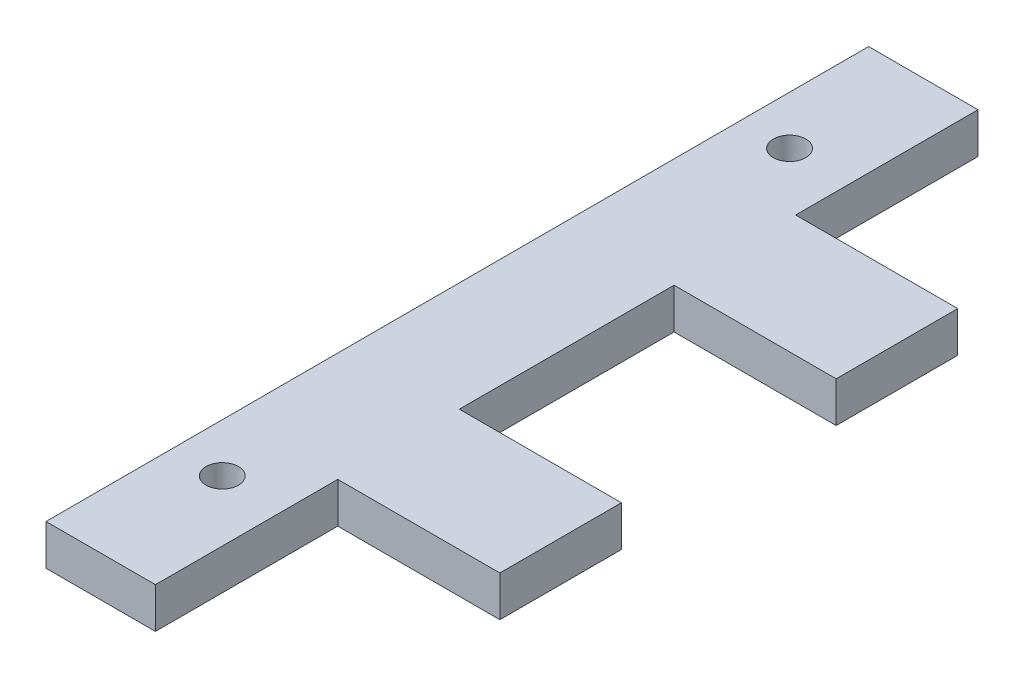
ISO-10303-21;
HEADER;
FILE_DESCRIPTION(('STEP AP214'),'2;1');
FILE_NAME('part.step','',(''),(''),'','','');
FILE_SCHEMA(('AUTOMOTIVE_DESIGN { 1 0 10303 214 1 1 1 1 }'));
ENDSEC;
DATA;
#1=APPLICATION_CONTEXT('core data for automotive mechanical design processes');
#2=APPLICATION_PROTOCOL_DEFINITION('international standard','automotive_design',2000,#1);
#3=PRODUCT_CONTEXT('',#1,'mechanical');
#4=PRODUCT('Part','Part','',(#3));
#5=PRODUCT_RELATED_PRODUCT_CATEGORY('part','',(#4));
#6=PRODUCT_DEFINITION_FORMATION('','',#4);
#7=PRODUCT_DEFINITION_CONTEXT('part definition',#1,'design');
#8=PRODUCT_DEFINITION('design','',#6,#7);
#9=PRODUCT_DEFINITION_SHAPE('','',#8);
#10=(LENGTH_UNIT() NAMED_UNIT(*) SI_UNIT(.MILLI.,.METRE.));
#11=(NAMED_UNIT(*) PLANE_ANGLE_UNIT() SI_UNIT($,.RADIAN.));
#12=(NAMED_UNIT(*) SI_UNIT($,.STERADIAN.) SOLID_ANGLE_UNIT());
#13=UNCERTAINTY_MEASURE_WITH_UNIT(LENGTH_MEASURE(1.E-05),#10,'distance_accuracy_value','');
#14=(GEOMETRIC_REPRESENTATION_CONTEXT(3) GLOBAL_UNCERTAINTY_ASSIGNED_CONTEXT((#13)) GLOBAL_UNIT_ASSIGNED_CONTEXT((#10,
#11,#12)) REPRESENTATION_CONTEXT('',''));
#15=CARTESIAN_POINT('',(0.,0.,0.));
#16=DIRECTION('',(0.,0.,1.));
#17=DIRECTION('',(1.,0.,0.));
#18=AXIS2_PLACEMENT_3D('',#15,#16,#17);
#19=CARTESIAN_POINT('',(2.7,1.,0.));
#20=DIRECTION('',(1.,0.,0.));
#21=DIRECTION('',(0.,0.,-1.));
#22=AXIS2_PLACEMENT_3D('',#19,#20,#21);
#23=PLANE('',#22);
#24=DIRECTION('',(0.,0.,1.));
#25=VECTOR('',#24,1.);
#26=CARTESIAN_POINT('',(2.7,0.,0.));
#27=LINE('',#26,#25);
#28=CARTESIAN_POINT('',(2.7,0.,0.));
#29=VERTEX_POINT('',#28);
#30=CARTESIAN_POINT('',(2.7,0.,4.5));
#31=VERTEX_POINT('',#30);
#32=EDGE_CURVE('E157',#29,#31,#27,.T.);
#33=ORIENTED_EDGE('',*,*,#32,.F.);
#34=DIRECTION('',(0.,-1.,0.));
#35=VECTOR('',#34,1.);
#36=CARTESIAN_POINT('',(2.7,1.,0.));
#37=LINE('',#36,#35);
#38=CARTESIAN_POINT('',(2.7,1.,0.));
#39=VERTEX_POINT('',#38);
#40=EDGE_CURVE('E11',#39,#29,#37,.T.);
#41=ORIENTED_EDGE('',*,*,#40,.F.);
#42=DIRECTION('',(0.,0.,1.));
#43=VECTOR('',#42,1.);
#44=CARTESIAN_POINT('',(2.7,1.,0.));
#45=LINE('',#44,#43);
#46=CARTESIAN_POINT('',(2.7,1.,4.5));
#47=VERTEX_POINT('',#46);
#48=EDGE_CURVE('E267',#39,#47,#45,.T.);
#49=ORIENTED_EDGE('',*,*,#48,.T.);
#50=DIRECTION('',(0.,-1.,0.));
#51=VECTOR('',#50,1.);
#52=CARTESIAN_POINT('',(2.7,1.,4.5));
#53=LINE('',#52,#51);
#54=EDGE_CURVE('E50',#47,#31,#53,.T.);
#55=ORIENTED_EDGE('',*,*,#54,.T.);
#56=EDGE_LOOP('',(#33,#41,#49,#55));
#57=FACE_BOUND('',#56,.T.);
#58=ADVANCED_FACE('F33',(#57),#23,.T.);
#59=CARTESIAN_POINT('',(0.,1.,0.));
#60=DIRECTION('',(0.,0.,-1.));
#61=DIRECTION('',(-1.,0.,0.));
#62=AXIS2_PLACEMENT_3D('',#59,#60,#61);
#63=PLANE('',#62);
#64=DIRECTION('',(1.,0.,0.));
#65=VECTOR('',#64,1.);
#66=CARTESIAN_POINT('',(0.,0.,0.));
#67=LINE('',#66,#65);
#68=CARTESIAN_POINT('',(0.,0.,0.));
#69=VERTEX_POINT('',#68);
#70=EDGE_CURVE('E159',#69,#29,#67,.T.);
#71=ORIENTED_EDGE('',*,*,#70,.F.);
#72=DIRECTION('',(0.,-1.,0.));
#73=VECTOR('',#72,1.);
#74=CARTESIAN_POINT('',(0.,1.,0.));
#75=LINE('',#74,#73);
#76=CARTESIAN_POINT('',(0.,1.,0.));
#77=VERTEX_POINT('',#76);
#78=EDGE_CURVE('E42',#77,#69,#75,.T.);
#79=ORIENTED_EDGE('',*,*,#78,.F.);
#80=DIRECTION('',(1.,0.,0.));
#81=VECTOR('',#80,1.);
#82=CARTESIAN_POINT('',(0.,1.,0.));
#83=LINE('',#82,#81);
#84=EDGE_CURVE('E216',#77,#39,#83,.T.);
#85=ORIENTED_EDGE('',*,*,#84,.T.);
#86=ORIENTED_EDGE('',*,*,#40,.T.);
#87=EDGE_LOOP('',(#71,#79,#85,#86));
#88=FACE_BOUND('',#87,.T.);
#89=ADVANCED_FACE('F215',(#88),#63,.T.);
#90=CARTESIAN_POINT('',(0.,1.,0.));
#91=DIRECTION('',(1.,0.,0.));
#92=DIRECTION('',(0.,0.,-1.));
#93=AXIS2_PLACEMENT_3D('',#90,#91,#92);
#94=PLANE('',#93);
#95=DIRECTION('',(0.,0.,1.));
#96=VECTOR('',#95,1.);
#97=CARTESIAN_POINT('',(0.,0.,0.));
#98=LINE('',#97,#96);
#99=CARTESIAN_POINT('',(0.,0.,20.3));
#100=VERTEX_POINT('',#99);
#101=EDGE_CURVE('E164',#69,#100,#98,.T.);
#102=ORIENTED_EDGE('',*,*,#101,.T.);
#103=DIRECTION('',(0.,-1.,0.));
#104=VECTOR('',#103,1.);
#105=CARTESIAN_POINT('',(0.,1.,20.3));
#106=LINE('',#105,#104);
#107=CARTESIAN_POINT('',(0.,1.,20.3));
#108=VERTEX_POINT('',#107);
#109=EDGE_CURVE('E199',#108,#100,#106,.T.);
#110=ORIENTED_EDGE('',*,*,#109,.F.);
#111=DIRECTION('',(0.,0.,1.));
#112=VECTOR('',#111,1.);
#113=CARTESIAN_POINT('',(0.,1.,0.));
#114=LINE('',#113,#112);
#115=EDGE_CURVE('E207',#77,#108,#114,.T.);
#116=ORIENTED_EDGE('',*,*,#115,.F.);
#117=ORIENTED_EDGE('',*,*,#78,.T.);
#118=EDGE_LOOP('',(#102,#110,#116,#117));
#119=FACE_BOUND('',#118,.T.);
#120=ADVANCED_FACE('F204',(#119),#94,.F.);
#121=CARTESIAN_POINT('',(0.,1.,20.3));
#122=DIRECTION('',(0.,0.,-1.));
#123=DIRECTION('',(-1.,0.,0.));
#124=AXIS2_PLACEMENT_3D('',#121,#122,#123);
#125=PLANE('',#124);
#126=DIRECTION('',(1.,0.,0.));
#127=VECTOR('',#126,1.);
#128=CARTESIAN_POINT('',(0.,0.,20.3));
#129=LINE('',#128,#127);
#130=CARTESIAN_POINT('',(2.7,0.,20.3));
#131=VERTEX_POINT('',#130);
#132=EDGE_CURVE('E167',#100,#131,#129,.T.);
#133=ORIENTED_EDGE('',*,*,#132,.T.);
#134=DIRECTION('',(0.,-1.,0.));
#135=VECTOR('',#134,1.);
#136=CARTESIAN_POINT('',(2.7,1.,20.3));
#137=LINE('',#136,#135);
#138=CARTESIAN_POINT('',(2.7,1.,20.3));
#139=VERTEX_POINT('',#138);
#140=EDGE_CURVE('E197',#139,#131,#137,.T.);
#141=ORIENTED_EDGE('',*,*,#140,.F.);
#142=DIRECTION('',(1.,0.,0.));
#143=VECTOR('',#142,1.);
#144=CARTESIAN_POINT('',(0.,1.,20.3));
#145=LINE('',#144,#143);
#146=EDGE_CURVE('E264',#108,#139,#145,.T.);
#147=ORIENTED_EDGE('',*,*,#146,.F.);
#148=ORIENTED_EDGE('',*,*,#109,.T.);
#149=EDGE_LOOP('',(#133,#141,#147,#148));
#150=FACE_BOUND('',#149,.T.);
#151=ADVANCED_FACE('F242',(#150),#125,.F.);
#152=CARTESIAN_POINT('',(2.7,0.,15.8));
#153=VERTEX_POINT('',#152);
#154=EDGE_CURVE('E161',#153,#131,#27,.T.);
#155=ORIENTED_EDGE('',*,*,#154,.F.);
#156=DIRECTION('',(0.,-1.,0.));
#157=VECTOR('',#156,1.);
#158=CARTESIAN_POINT('',(2.7,1.,15.8));
#159=LINE('',#158,#157);
#160=CARTESIAN_POINT('',(2.7,1.,15.8));
#161=VERTEX_POINT('',#160);
#162=EDGE_CURVE('E195',#161,#153,#159,.T.);
#163=ORIENTED_EDGE('',*,*,#162,.F.);
#164=EDGE_CURVE('E262',#161,#139,#45,.T.);
#165=ORIENTED_EDGE('',*,*,#164,.T.);
#166=ORIENTED_EDGE('',*,*,#140,.T.);
#167=EDGE_LOOP('',(#155,#163,#165,#166));
#168=FACE_BOUND('',#167,.T.);
#169=ADVANCED_FACE('F232',(#168),#23,.T.);
#170=CARTESIAN_POINT('',(0.,1.,15.8));
#171=DIRECTION('',(0.,0.,-1.));
#172=DIRECTION('',(-1.,0.,0.));
#173=AXIS2_PLACEMENT_3D('',#170,#171,#172);
#174=PLANE('',#173);
#175=DIRECTION('',(1.,0.,0.));
#176=VECTOR('',#175,1.);
#177=CARTESIAN_POINT('',(0.,0.,15.8));
#178=LINE('',#177,#176);
#179=CARTESIAN_POINT('',(6.7,0.,15.8));
#180=VERTEX_POINT('',#179);
#181=EDGE_CURVE('E170',#153,#180,#178,.T.);
#182=ORIENTED_EDGE('',*,*,#181,.T.);
#183=DIRECTION('',(0.,-1.,0.));
#184=VECTOR('',#183,1.);
#185=CARTESIAN_POINT('',(6.7,1.,15.8));
#186=LINE('',#185,#184);
#187=CARTESIAN_POINT('',(6.7,1.,15.8));
#188=VERTEX_POINT('',#187);
#189=EDGE_CURVE('E193',#188,#180,#186,.T.);
#190=ORIENTED_EDGE('',*,*,#189,.F.);
#191=DIRECTION('',(1.,0.,0.));
#192=VECTOR('',#191,1.);
#193=CARTESIAN_POINT('',(0.,1.,15.8));
#194=LINE('',#193,#192);
#195=EDGE_CURVE('E271',#161,#188,#194,.T.);
#196=ORIENTED_EDGE('',*,*,#195,.F.);
#197=ORIENTED_EDGE('',*,*,#162,.T.);
#198=EDGE_LOOP('',(#182,#190,#196,#197));
#199=FACE_BOUND('',#198,.T.);
#200=ADVANCED_FACE('F241',(#199),#174,.F.);
#201=CARTESIAN_POINT('',(6.7,1.,0.));
#202=DIRECTION('',(1.,0.,0.));
#203=DIRECTION('',(0.,0.,-1.));
#204=AXIS2_PLACEMENT_3D('',#201,#202,#203);
#205=PLANE('',#204);
#206=DIRECTION('',(0.,0.,1.));
#207=VECTOR('',#206,1.);
#208=CARTESIAN_POINT('',(6.7,0.,0.));
#209=LINE('',#208,#207);
#210=CARTESIAN_POINT('',(6.7,0.,12.8));
#211=VERTEX_POINT('',#210);
#212=EDGE_CURVE('E173',#211,#180,#209,.T.);
#213=ORIENTED_EDGE('',*,*,#212,.F.);
#214=DIRECTION('',(0.,-1.,0.));
#215=VECTOR('',#214,1.);
#216=CARTESIAN_POINT('',(6.7,1.,12.8));
#217=LINE('',#216,#215);
#218=CARTESIAN_POINT('',(6.7,1.,12.8));
#219=VERTEX_POINT('',#218);
#220=EDGE_CURVE('E191',#219,#211,#217,.T.);
#221=ORIENTED_EDGE('',*,*,#220,.F.);
#222=DIRECTION('',(0.,0.,1.));
#223=VECTOR('',#222,1.);
#224=CARTESIAN_POINT('',(6.7,1.,0.));
#225=LINE('',#224,#223);
#226=EDGE_CURVE('E273',#219,#188,#225,.T.);
#227=ORIENTED_EDGE('',*,*,#226,.T.);
#228=ORIENTED_EDGE('',*,*,#189,.T.);
#229=EDGE_LOOP('',(#213,#221,#227,#228));
#230=FACE_BOUND('',#229,.T.);
#231=ADVANCED_FACE('F251',(#230),#205,.T.);
#232=CARTESIAN_POINT('',(0.,1.,12.8));
#233=DIRECTION('',(0.,0.,-1.));
#234=DIRECTION('',(-1.,0.,0.));
#235=AXIS2_PLACEMENT_3D('',#232,#233,#234);
#236=PLANE('',#235);
#237=DIRECTION('',(1.,0.,0.));
#238=VECTOR('',#237,1.);
#239=CARTESIAN_POINT('',(0.,0.,12.8));
#240=LINE('',#239,#238);
#241=CARTESIAN_POINT('',(2.7,0.,12.8));
#242=VERTEX_POINT('',#241);
#243=EDGE_CURVE('E176',#242,#211,#240,.T.);
#244=ORIENTED_EDGE('',*,*,#243,.F.);
#245=DIRECTION('',(0.,-1.,0.));
#246=VECTOR('',#245,1.);
#247=CARTESIAN_POINT('',(2.7,1.,12.8));
#248=LINE('',#247,#246);
#249=CARTESIAN_POINT('',(2.7,1.,12.8));
#250=VERTEX_POINT('',#249);
#251=EDGE_CURVE('E189',#250,#242,#248,.T.);
#252=ORIENTED_EDGE('',*,*,#251,.F.);
#253=DIRECTION('',(1.,0.,0.));
#254=VECTOR('',#253,1.);
#255=CARTESIAN_POINT('',(0.,1.,12.8));
#256=LINE('',#255,#254);
#257=EDGE_CURVE('E275',#250,#219,#256,.T.);
#258=ORIENTED_EDGE('',*,*,#257,.T.);
#259=ORIENTED_EDGE('',*,*,#220,.T.);
#260=EDGE_LOOP('',(#244,#252,#258,#259));
#261=FACE_BOUND('',#260,.T.);
#262=ADVANCED_FACE('F245',(#261),#236,.T.);
#263=CARTESIAN_POINT('',(2.7,0.,7.5));
#264=VERTEX_POINT('',#263);
#265=EDGE_CURVE('E160',#264,#242,#27,.T.);
#266=ORIENTED_EDGE('',*,*,#265,.F.);
#267=DIRECTION('',(0.,-1.,0.));
#268=VECTOR('',#267,1.);
#269=CARTESIAN_POINT('',(2.7,1.,7.5));
#270=LINE('',#269,#268);
#271=CARTESIAN_POINT('',(2.7,1.,7.5));
#272=VERTEX_POINT('',#271);
#273=EDGE_CURVE('E143',#272,#264,#270,.T.);
#274=ORIENTED_EDGE('',*,*,#273,.F.);
#275=EDGE_CURVE('E133',#272,#250,#45,.T.);
#276=ORIENTED_EDGE('',*,*,#275,.T.);
#277=ORIENTED_EDGE('',*,*,#251,.T.);
#278=EDGE_LOOP('',(#266,#274,#276,#277));
#279=FACE_BOUND('',#278,.T.);
#280=ADVANCED_FACE('F233',(#279),#23,.T.);
#281=CARTESIAN_POINT('',(0.,1.,7.5));
#282=DIRECTION('',(0.,0.,-1.));
#283=DIRECTION('',(-1.,0.,0.));
#284=AXIS2_PLACEMENT_3D('',#281,#282,#283);
#285=PLANE('',#284);
#286=DIRECTION('',(1.,0.,0.));
#287=VECTOR('',#286,1.);
#288=CARTESIAN_POINT('',(0.,0.,7.5));
#289=LINE('',#288,#287);
#290=CARTESIAN_POINT('',(6.7,0.,7.5));
#291=VERTEX_POINT('',#290);
#292=EDGE_CURVE('E140',#264,#291,#289,.T.);
#293=ORIENTED_EDGE('',*,*,#292,.T.);
#294=DIRECTION('',(0.,-1.,0.));
#295=VECTOR('',#294,1.);
#296=CARTESIAN_POINT('',(6.7,1.,7.5));
#297=LINE('',#296,#295);
#298=CARTESIAN_POINT('',(6.7,1.,7.5));
#299=VERTEX_POINT('',#298);
#300=EDGE_CURVE('E137',#299,#291,#297,.T.);
#301=ORIENTED_EDGE('',*,*,#300,.F.);
#302=DIRECTION('',(1.,0.,0.));
#303=VECTOR('',#302,1.);
#304=CARTESIAN_POINT('',(0.,1.,7.5));
#305=LINE('',#304,#303);
#306=EDGE_CURVE('E125',#272,#299,#305,.T.);
#307=ORIENTED_EDGE('',*,*,#306,.F.);
#308=ORIENTED_EDGE('',*,*,#273,.T.);
#309=EDGE_LOOP('',(#293,#301,#307,#308));
#310=FACE_BOUND('',#309,.T.);
#311=ADVANCED_FACE('F138',(#310),#285,.F.);
#312=CARTESIAN_POINT('',(6.7,1.,0.));
#313=DIRECTION('',(1.,0.,0.));
#314=DIRECTION('',(0.,0.,-1.));
#315=AXIS2_PLACEMENT_3D('',#312,#313,#314);
#316=PLANE('',#315);
#317=DIRECTION('',(0.,0.,1.));
#318=VECTOR('',#317,1.);
#319=CARTESIAN_POINT('',(6.7,0.,0.));
#320=LINE('',#319,#318);
#321=CARTESIAN_POINT('',(6.7,0.,4.5));
#322=VERTEX_POINT('',#321);
#323=EDGE_CURVE('E180',#322,#291,#320,.T.);
#324=ORIENTED_EDGE('',*,*,#323,.F.);
#325=DIRECTION('',(0.,-1.,0.));
#326=VECTOR('',#325,1.);
#327=CARTESIAN_POINT('',(6.7,1.,4.5));
#328=LINE('',#327,#326);
#329=CARTESIAN_POINT('',(6.7,1.,4.5));
#330=VERTEX_POINT('',#329);
#331=EDGE_CURVE('E87',#330,#322,#328,.T.);
#332=ORIENTED_EDGE('',*,*,#331,.F.);
#333=DIRECTION('',(0.,0.,1.));
#334=VECTOR('',#333,1.);
#335=CARTESIAN_POINT('',(6.7,1.,0.));
#336=LINE('',#335,#334);
#337=EDGE_CURVE('E130',#330,#299,#336,.T.);
#338=ORIENTED_EDGE('',*,*,#337,.T.);
#339=ORIENTED_EDGE('',*,*,#300,.T.);
#340=EDGE_LOOP('',(#324,#332,#338,#339));
#341=FACE_BOUND('',#340,.T.);
#342=ADVANCED_FACE('F145',(#341),#316,.T.);
#343=CARTESIAN_POINT('',(1.2,1.,3.15));
#344=DIRECTION('',(0.,-1.,0.));
#345=DIRECTION('',(0.,0.,-1.));
#346=AXIS2_PLACEMENT_3D('',#343,#344,#345);
#347=CYLINDRICAL_SURFACE('',#346,0.4);
#348=CARTESIAN_POINT('',(1.2,1.,3.15));
#349=DIRECTION('',(0.,1.,0.));
#350=DIRECTION('',(0.,0.,1.));
#351=AXIS2_PLACEMENT_3D('',#348,#349,#350);
#352=CIRCLE('',#351,0.4);
#353=CARTESIAN_POINT('',(1.2,1.,3.55));
#354=VERTEX_POINT('',#353);
#355=EDGE_CURVE('E278',#354,#354,#352,.T.);
#356=ORIENTED_EDGE('',*,*,#355,.T.);
#357=EDGE_LOOP('',(#356));
#358=FACE_BOUND('',#357,.T.);
#359=CARTESIAN_POINT('',(1.2,0.,3.15));
#360=DIRECTION('',(0.,1.,0.));
#361=DIRECTION('',(0.,0.,1.));
#362=AXIS2_PLACEMENT_3D('',#359,#360,#361);
#363=CIRCLE('',#362,0.4);
#364=CARTESIAN_POINT('',(1.2,0.,3.55));
#365=VERTEX_POINT('',#364);
#366=EDGE_CURVE('E154',#365,#365,#363,.T.);
#367=ORIENTED_EDGE('',*,*,#366,.F.);
#368=EDGE_LOOP('',(#367));
#369=FACE_BOUND('',#368,.T.);
#370=ADVANCED_FACE('F226',(#358,#369),#347,.F.);
#371=CARTESIAN_POINT('',(1.2,1.,17.15));
#372=DIRECTION('',(0.,-1.,0.));
#373=DIRECTION('',(0.,0.,-1.));
#374=AXIS2_PLACEMENT_3D('',#371,#372,#373);
#375=CYLINDRICAL_SURFACE('',#374,0.4);
#376=CARTESIAN_POINT('',(1.2,1.,17.15));
#377=DIRECTION('',(0.,1.,0.));
#378=DIRECTION('',(0.,0.,1.));
#379=AXIS2_PLACEMENT_3D('',#376,#377,#378);
#380=CIRCLE('',#379,0.4);
#381=CARTESIAN_POINT('',(1.2,1.,17.55));
#382=VERTEX_POINT('',#381);
#383=EDGE_CURVE('E185',#382,#382,#380,.T.);
#384=ORIENTED_EDGE('',*,*,#383,.T.);
#385=EDGE_LOOP('',(#384));
#386=FACE_BOUND('',#385,.T.);
#387=CARTESIAN_POINT('',(1.2,0.,17.15));
#388=DIRECTION('',(0.,1.,0.));
#389=DIRECTION('',(0.,0.,1.));
#390=AXIS2_PLACEMENT_3D('',#387,#388,#389);
#391=CIRCLE('',#390,0.4);
#392=CARTESIAN_POINT('',(1.2,0.,17.55));
#393=VERTEX_POINT('',#392);
#394=EDGE_CURVE('E151',#393,#393,#391,.T.);
#395=ORIENTED_EDGE('',*,*,#394,.F.);
#396=EDGE_LOOP('',(#395));
#397=FACE_BOUND('',#396,.T.);
#398=ADVANCED_FACE('F35',(#386,#397),#375,.F.);
#399=CARTESIAN_POINT('',(0.,1.,4.5));
#400=DIRECTION('',(0.,0.,-1.));
#401=DIRECTION('',(-1.,0.,0.));
#402=AXIS2_PLACEMENT_3D('',#399,#400,#401);
#403=PLANE('',#402);
#404=DIRECTION('',(1.,0.,0.));
#405=VECTOR('',#404,1.);
#406=CARTESIAN_POINT('',(0.,0.,4.5));
#407=LINE('',#406,#405);
#408=EDGE_CURVE('E182',#31,#322,#407,.T.);
#409=ORIENTED_EDGE('',*,*,#408,.F.);
#410=ORIENTED_EDGE('',*,*,#54,.F.);
#411=DIRECTION('',(1.,0.,0.));
#412=VECTOR('',#411,1.);
#413=CARTESIAN_POINT('',(0.,1.,4.5));
#414=LINE('',#413,#412);
#415=EDGE_CURVE('E146',#47,#330,#414,.T.);
#416=ORIENTED_EDGE('',*,*,#415,.T.);
#417=ORIENTED_EDGE('',*,*,#331,.T.);
#418=EDGE_LOOP('',(#409,#410,#416,#417));
#419=FACE_BOUND('',#418,.T.);
#420=ADVANCED_FACE('F217',(#419),#403,.T.);
#421=CARTESIAN_POINT('',(0.,1.,0.));
#422=DIRECTION('',(0.,1.,0.));
#423=DIRECTION('',(0.,0.,1.));
#424=AXIS2_PLACEMENT_3D('',#421,#422,#423);
#425=PLANE('',#424);
#426=ORIENTED_EDGE('',*,*,#383,.F.);
#427=EDGE_LOOP('',(#426));
#428=FACE_BOUND('',#427,.T.);
#429=ORIENTED_EDGE('',*,*,#355,.F.);
#430=EDGE_LOOP('',(#429));
#431=FACE_BOUND('',#430,.T.);
#432=ORIENTED_EDGE('',*,*,#48,.F.);
#433=ORIENTED_EDGE('',*,*,#84,.F.);
#434=ORIENTED_EDGE('',*,*,#115,.T.);
#435=ORIENTED_EDGE('',*,*,#146,.T.);
#436=ORIENTED_EDGE('',*,*,#164,.F.);
#437=ORIENTED_EDGE('',*,*,#195,.T.);
#438=ORIENTED_EDGE('',*,*,#226,.F.);
#439=ORIENTED_EDGE('',*,*,#257,.F.);
#440=ORIENTED_EDGE('',*,*,#275,.F.);
#441=ORIENTED_EDGE('',*,*,#306,.T.);
#442=ORIENTED_EDGE('',*,*,#337,.F.);
#443=ORIENTED_EDGE('',*,*,#415,.F.);
#444=EDGE_LOOP('',(#432,#433,#434,#435,#436,#437,#438,#439,#440,#441,#442,#443));
#445=FACE_BOUND('',#444,.T.);
#446=ADVANCED_FACE('F127',(#428,#431,#445),#425,.T.);
#447=CARTESIAN_POINT('',(0.,0.,0.));
#448=DIRECTION('',(0.,1.,0.));
#449=DIRECTION('',(0.,0.,1.));
#450=AXIS2_PLACEMENT_3D('',#447,#448,#449);
#451=PLANE('',#450);
#452=ORIENTED_EDGE('',*,*,#394,.T.);
#453=EDGE_LOOP('',(#452));
#454=FACE_BOUND('',#453,.T.);
#455=ORIENTED_EDGE('',*,*,#366,.T.);
#456=EDGE_LOOP('',(#455));
#457=FACE_BOUND('',#456,.T.);
#458=ORIENTED_EDGE('',*,*,#32,.T.);
#459=ORIENTED_EDGE('',*,*,#408,.T.);
#460=ORIENTED_EDGE('',*,*,#323,.T.);
#461=ORIENTED_EDGE('',*,*,#292,.F.);
#462=ORIENTED_EDGE('',*,*,#265,.T.);
#463=ORIENTED_EDGE('',*,*,#243,.T.);
#464=ORIENTED_EDGE('',*,*,#212,.T.);
#465=ORIENTED_EDGE('',*,*,#181,.F.);
#466=ORIENTED_EDGE('',*,*,#154,.T.);
#467=ORIENTED_EDGE('',*,*,#132,.F.);
#468=ORIENTED_EDGE('',*,*,#101,.F.);
#469=ORIENTED_EDGE('',*,*,#70,.T.);
#470=EDGE_LOOP('',(#458,#459,#460,#461,#462,#463,#464,#465,#466,#467,#468,#469));
#471=FACE_BOUND('',#470,.T.);
#472=ADVANCED_FACE('F213',(#454,#457,#471),#451,.F.);
#473=CLOSED_SHELL('',(#58,#89,#120,#151,#169,#200,#231,#262,#280,#311,#342,#370,#398,#420,#446,#472));
#474=MANIFOLD_SOLID_BREP('B2',#473);
#475=ADVANCED_BREP_SHAPE_REPRESENTATION('',(#18,#474),#14);
#476=SHAPE_DEFINITION_REPRESENTATION(#9,#475);
ENDSEC;
END-ISO-10303-21;
